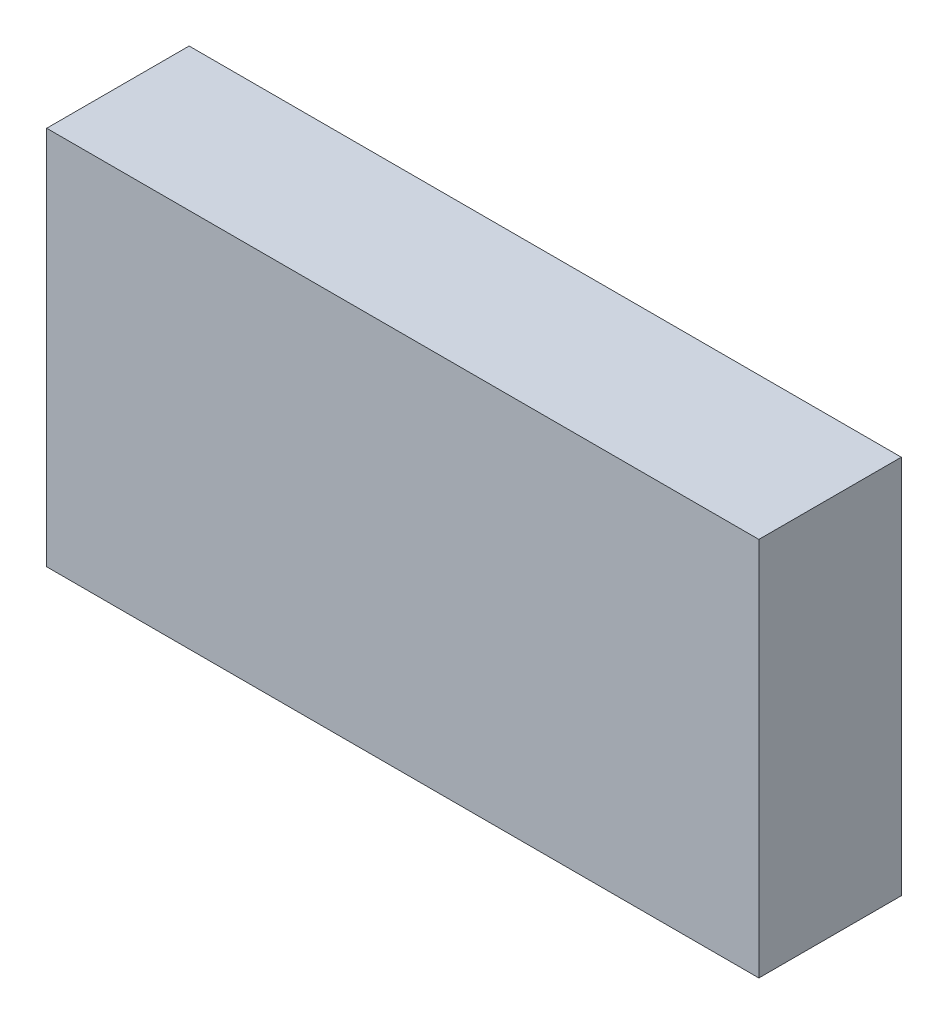
ISO-10303-21;
HEADER;
FILE_DESCRIPTION(('STEP AP214'),'2;1');
FILE_NAME('part.step','',(''),(''),'','','');
FILE_SCHEMA(('AUTOMOTIVE_DESIGN { 1 0 10303 214 1 1 1 1 }'));
ENDSEC;
DATA;
#1=APPLICATION_CONTEXT('core data for automotive mechanical design processes');
#2=APPLICATION_PROTOCOL_DEFINITION('international standard','automotive_design',2000,#1);
#3=PRODUCT_CONTEXT('',#1,'mechanical');
#4=PRODUCT('Part','Part','',(#3));
#5=PRODUCT_RELATED_PRODUCT_CATEGORY('part','',(#4));
#6=PRODUCT_DEFINITION_FORMATION('','',#4);
#7=PRODUCT_DEFINITION_CONTEXT('part definition',#1,'design');
#8=PRODUCT_DEFINITION('design','',#6,#7);
#9=PRODUCT_DEFINITION_SHAPE('','',#8);
#10=(LENGTH_UNIT() NAMED_UNIT(*) SI_UNIT(.MILLI.,.METRE.));
#11=(NAMED_UNIT(*) PLANE_ANGLE_UNIT() SI_UNIT($,.RADIAN.));
#12=(NAMED_UNIT(*) SI_UNIT($,.STERADIAN.) SOLID_ANGLE_UNIT());
#13=UNCERTAINTY_MEASURE_WITH_UNIT(LENGTH_MEASURE(1.E-05),#10,'distance_accuracy_value','');
#14=(GEOMETRIC_REPRESENTATION_CONTEXT(3) GLOBAL_UNCERTAINTY_ASSIGNED_CONTEXT((#13)) GLOBAL_UNIT_ASSIGNED_CONTEXT((#10,
#11,#12)) REPRESENTATION_CONTEXT('',''));
#15=CARTESIAN_POINT('',(0.,0.,0.));
#16=DIRECTION('',(0.,0.,1.));
#17=DIRECTION('',(1.,0.,0.));
#18=AXIS2_PLACEMENT_3D('',#15,#16,#17);
#19=CARTESIAN_POINT('',(596.,290.,-3.));
#20=DIRECTION('',(-1.,0.,0.));
#21=DIRECTION('',(0.,0.,1.));
#22=AXIS2_PLACEMENT_3D('',#19,#20,#21);
#23=PLANE('',#22);
#24=DIRECTION('',(0.,-1.,0.));
#25=VECTOR('',#24,1.);
#26=CARTESIAN_POINT('',(596.,290.,0.));
#27=LINE('',#26,#25);
#28=CARTESIAN_POINT('',(596.,298.,0.));
#29=VERTEX_POINT('',#28);
#30=CARTESIAN_POINT('',(596.,290.,0.));
#31=VERTEX_POINT('',#30);
#32=EDGE_CURVE('E103',#29,#31,#27,.T.);
#33=ORIENTED_EDGE('',*,*,#32,.F.);
#34=DIRECTION('',(0.,0.,1.));
#35=VECTOR('',#34,1.);
#36=CARTESIAN_POINT('',(596.,298.,-3.));
#37=LINE('',#36,#35);
#38=CARTESIAN_POINT('',(596.,298.,-3.));
#39=VERTEX_POINT('',#38);
#40=EDGE_CURVE('E11',#39,#29,#37,.T.);
#41=ORIENTED_EDGE('',*,*,#40,.F.);
#42=DIRECTION('',(0.,-1.,0.));
#43=VECTOR('',#42,1.);
#44=CARTESIAN_POINT('',(596.,290.,-3.));
#45=LINE('',#44,#43);
#46=CARTESIAN_POINT('',(596.,290.,-3.));
#47=VERTEX_POINT('',#46);
#48=EDGE_CURVE('E97',#39,#47,#45,.T.);
#49=ORIENTED_EDGE('',*,*,#48,.T.);
#50=DIRECTION('',(0.,0.,1.));
#51=VECTOR('',#50,1.);
#52=CARTESIAN_POINT('',(596.,290.,-3.));
#53=LINE('',#52,#51);
#54=EDGE_CURVE('E42',#47,#31,#53,.T.);
#55=ORIENTED_EDGE('',*,*,#54,.T.);
#56=EDGE_LOOP('',(#33,#41,#49,#55));
#57=FACE_BOUND('',#56,.T.);
#58=ADVANCED_FACE('F39',(#57),#23,.T.);
#59=CARTESIAN_POINT('',(596.,298.,-3.));
#60=DIRECTION('',(0.,1.,0.));
#61=DIRECTION('',(0.,0.,1.));
#62=AXIS2_PLACEMENT_3D('',#59,#60,#61);
#63=PLANE('',#62);
#64=DIRECTION('',(-1.,0.,0.));
#65=VECTOR('',#64,1.);
#66=CARTESIAN_POINT('',(596.,298.,0.));
#67=LINE('',#66,#65);
#68=CARTESIAN_POINT('',(611.,298.,0.));
#69=VERTEX_POINT('',#68);
#70=EDGE_CURVE('E99',#69,#29,#67,.T.);
#71=ORIENTED_EDGE('',*,*,#70,.F.);
#72=DIRECTION('',(0.,0.,1.));
#73=VECTOR('',#72,1.);
#74=CARTESIAN_POINT('',(611.,298.,-3.));
#75=LINE('',#74,#73);
#76=CARTESIAN_POINT('',(611.,298.,-3.));
#77=VERTEX_POINT('',#76);
#78=EDGE_CURVE('E48',#77,#69,#75,.T.);
#79=ORIENTED_EDGE('',*,*,#78,.F.);
#80=DIRECTION('',(-1.,0.,0.));
#81=VECTOR('',#80,1.);
#82=CARTESIAN_POINT('',(596.,298.,-3.));
#83=LINE('',#82,#81);
#84=EDGE_CURVE('E94',#77,#39,#83,.T.);
#85=ORIENTED_EDGE('',*,*,#84,.T.);
#86=ORIENTED_EDGE('',*,*,#40,.T.);
#87=EDGE_LOOP('',(#71,#79,#85,#86));
#88=FACE_BOUND('',#87,.T.);
#89=ADVANCED_FACE('F113',(#88),#63,.T.);
#90=CARTESIAN_POINT('',(611.,290.,-3.));
#91=DIRECTION('',(1.,0.,0.));
#92=DIRECTION('',(0.,0.,-1.));
#93=AXIS2_PLACEMENT_3D('',#90,#91,#92);
#94=PLANE('',#93);
#95=DIRECTION('',(0.,1.,0.));
#96=VECTOR('',#95,1.);
#97=CARTESIAN_POINT('',(611.,290.,0.));
#98=LINE('',#97,#96);
#99=CARTESIAN_POINT('',(611.,290.,0.));
#100=VERTEX_POINT('',#99);
#101=EDGE_CURVE('E89',#100,#69,#98,.T.);
#102=ORIENTED_EDGE('',*,*,#101,.F.);
#103=DIRECTION('',(0.,0.,1.));
#104=VECTOR('',#103,1.);
#105=CARTESIAN_POINT('',(611.,290.,-3.));
#106=LINE('',#105,#104);
#107=CARTESIAN_POINT('',(611.,290.,-3.));
#108=VERTEX_POINT('',#107);
#109=EDGE_CURVE('E84',#108,#100,#106,.T.);
#110=ORIENTED_EDGE('',*,*,#109,.F.);
#111=DIRECTION('',(0.,1.,0.));
#112=VECTOR('',#111,1.);
#113=CARTESIAN_POINT('',(611.,290.,-3.));
#114=LINE('',#113,#112);
#115=EDGE_CURVE('E87',#108,#77,#114,.T.);
#116=ORIENTED_EDGE('',*,*,#115,.T.);
#117=ORIENTED_EDGE('',*,*,#78,.T.);
#118=EDGE_LOOP('',(#102,#110,#116,#117));
#119=FACE_BOUND('',#118,.T.);
#120=ADVANCED_FACE('F86',(#119),#94,.T.);
#121=CARTESIAN_POINT('',(596.,290.,-3.));
#122=DIRECTION('',(0.,-1.,0.));
#123=DIRECTION('',(0.,0.,-1.));
#124=AXIS2_PLACEMENT_3D('',#121,#122,#123);
#125=PLANE('',#124);
#126=DIRECTION('',(1.,0.,0.));
#127=VECTOR('',#126,1.);
#128=CARTESIAN_POINT('',(596.,290.,0.));
#129=LINE('',#128,#127);
#130=EDGE_CURVE('E106',#31,#100,#129,.T.);
#131=ORIENTED_EDGE('',*,*,#130,.F.);
#132=ORIENTED_EDGE('',*,*,#54,.F.);
#133=DIRECTION('',(1.,0.,0.));
#134=VECTOR('',#133,1.);
#135=CARTESIAN_POINT('',(596.,290.,-3.));
#136=LINE('',#135,#134);
#137=EDGE_CURVE('E93',#47,#108,#136,.T.);
#138=ORIENTED_EDGE('',*,*,#137,.T.);
#139=ORIENTED_EDGE('',*,*,#109,.T.);
#140=EDGE_LOOP('',(#131,#132,#138,#139));
#141=FACE_BOUND('',#140,.T.);
#142=ADVANCED_FACE('F96',(#141),#125,.T.);
#143=CARTESIAN_POINT('',(0.,0.,-3.));
#144=DIRECTION('',(0.,0.,-1.));
#145=DIRECTION('',(-1.,0.,0.));
#146=AXIS2_PLACEMENT_3D('',#143,#144,#145);
#147=PLANE('',#146);
#148=ORIENTED_EDGE('',*,*,#48,.F.);
#149=ORIENTED_EDGE('',*,*,#84,.F.);
#150=ORIENTED_EDGE('',*,*,#115,.F.);
#151=ORIENTED_EDGE('',*,*,#137,.F.);
#152=EDGE_LOOP('',(#148,#149,#150,#151));
#153=FACE_BOUND('',#152,.T.);
#154=ADVANCED_FACE('F92',(#153),#147,.T.);
#155=CARTESIAN_POINT('',(0.,0.,0.));
#156=DIRECTION('',(0.,0.,-1.));
#157=DIRECTION('',(-1.,0.,0.));
#158=AXIS2_PLACEMENT_3D('',#155,#156,#157);
#159=PLANE('',#158);
#160=ORIENTED_EDGE('',*,*,#32,.T.);
#161=ORIENTED_EDGE('',*,*,#130,.T.);
#162=ORIENTED_EDGE('',*,*,#101,.T.);
#163=ORIENTED_EDGE('',*,*,#70,.T.);
#164=EDGE_LOOP('',(#160,#161,#162,#163));
#165=FACE_BOUND('',#164,.T.);
#166=ADVANCED_FACE('F112',(#165),#159,.F.);
#167=CLOSED_SHELL('',(#58,#89,#120,#142,#154,#166));
#168=MANIFOLD_SOLID_BREP('B2',#167);
#169=ADVANCED_BREP_SHAPE_REPRESENTATION('',(#18,#168),#14);
#170=SHAPE_DEFINITION_REPRESENTATION(#9,#169);
ENDSEC;
END-ISO-10303-21;
